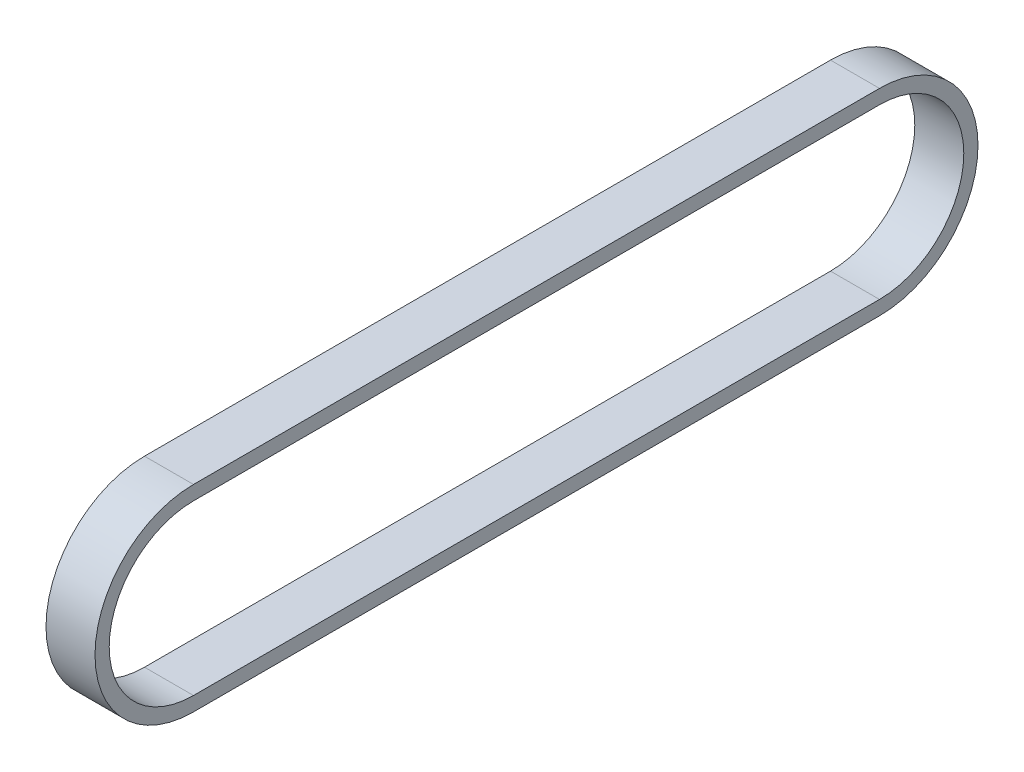
ISO-10303-21;
HEADER;
FILE_DESCRIPTION(('STEP AP214'),'2;1');
FILE_NAME('part.step','',(''),(''),'','','');
FILE_SCHEMA(('AUTOMOTIVE_DESIGN { 1 0 10303 214 1 1 1 1 }'));
ENDSEC;
DATA;
#1=APPLICATION_CONTEXT('core data for automotive mechanical design processes');
#2=APPLICATION_PROTOCOL_DEFINITION('international standard','automotive_design',2000,#1);
#3=PRODUCT_CONTEXT('',#1,'mechanical');
#4=PRODUCT('Part','Part','',(#3));
#5=PRODUCT_RELATED_PRODUCT_CATEGORY('part','',(#4));
#6=PRODUCT_DEFINITION_FORMATION('','',#4);
#7=PRODUCT_DEFINITION_CONTEXT('part definition',#1,'design');
#8=PRODUCT_DEFINITION('design','',#6,#7);
#9=PRODUCT_DEFINITION_SHAPE('','',#8);
#10=(LENGTH_UNIT() NAMED_UNIT(*) SI_UNIT(.MILLI.,.METRE.));
#11=(NAMED_UNIT(*) PLANE_ANGLE_UNIT() SI_UNIT($,.RADIAN.));
#12=(NAMED_UNIT(*) SI_UNIT($,.STERADIAN.) SOLID_ANGLE_UNIT());
#13=UNCERTAINTY_MEASURE_WITH_UNIT(LENGTH_MEASURE(1.E-05),#10,'distance_accuracy_value','');
#14=(GEOMETRIC_REPRESENTATION_CONTEXT(3) GLOBAL_UNCERTAINTY_ASSIGNED_CONTEXT((#13)) GLOBAL_UNIT_ASSIGNED_CONTEXT((#10,
#11,#12)) REPRESENTATION_CONTEXT('',''));
#15=CARTESIAN_POINT('',(0.,0.,0.));
#16=DIRECTION('',(0.,0.,1.));
#17=DIRECTION('',(1.,0.,0.));
#18=AXIS2_PLACEMENT_3D('',#15,#16,#17);
#19=CARTESIAN_POINT('',(12.7,0.,0.));
#20=DIRECTION('',(1.,0.,0.));
#21=DIRECTION('',(0.,0.,-1.));
#22=AXIS2_PLACEMENT_3D('',#19,#20,#21);
#23=PLANE('',#22);
#24=CARTESIAN_POINT('',(12.7,0.,0.));
#25=DIRECTION('',(1.,0.,0.));
#26=DIRECTION('',(0.,0.,-1.));
#27=AXIS2_PLACEMENT_3D('',#24,#25,#26);
#28=CIRCLE('',#27,25.527);
#29=CARTESIAN_POINT('',(12.7,25.527,0.));
#30=VERTEX_POINT('',#29);
#31=CARTESIAN_POINT('',(12.7,-25.527,0.));
#32=VERTEX_POINT('',#31);
#33=EDGE_CURVE('E135',#30,#32,#28,.T.);
#34=ORIENTED_EDGE('',*,*,#33,.T.);
#35=DIRECTION('',(0.,0.,-1.));
#36=VECTOR('',#35,1.);
#37=CARTESIAN_POINT('',(12.7,-25.527,0.));
#38=LINE('',#37,#36);
#39=CARTESIAN_POINT('',(12.7,-25.527,-177.8));
#40=VERTEX_POINT('',#39);
#41=EDGE_CURVE('E138',#32,#40,#38,.T.);
#42=ORIENTED_EDGE('',*,*,#41,.T.);
#43=CARTESIAN_POINT('',(12.7,0.,-177.8));
#44=DIRECTION('',(1.,0.,0.));
#45=DIRECTION('',(0.,0.,-1.));
#46=AXIS2_PLACEMENT_3D('',#43,#44,#45);
#47=CIRCLE('',#46,25.527);
#48=CARTESIAN_POINT('',(12.7,25.527,-177.8));
#49=VERTEX_POINT('',#48);
#50=EDGE_CURVE('E141',#40,#49,#47,.T.);
#51=ORIENTED_EDGE('',*,*,#50,.T.);
#52=DIRECTION('',(0.,0.,1.));
#53=VECTOR('',#52,1.);
#54=CARTESIAN_POINT('',(12.7,25.527,0.));
#55=LINE('',#54,#53);
#56=EDGE_CURVE('E143',#49,#30,#55,.T.);
#57=ORIENTED_EDGE('',*,*,#56,.T.);
#58=EDGE_LOOP('',(#34,#42,#51,#57));
#59=FACE_BOUND('',#58,.T.);
#60=DIRECTION('',(0.,0.,-1.));
#61=VECTOR('',#60,1.);
#62=CARTESIAN_POINT('',(12.7,-21.844,0.));
#63=LINE('',#62,#61);
#64=CARTESIAN_POINT('',(12.7,-21.844,0.));
#65=VERTEX_POINT('',#64);
#66=CARTESIAN_POINT('',(12.7,-21.844,-177.8));
#67=VERTEX_POINT('',#66);
#68=EDGE_CURVE('E107',#65,#67,#63,.T.);
#69=ORIENTED_EDGE('',*,*,#68,.F.);
#70=CARTESIAN_POINT('',(12.7,0.,0.));
#71=DIRECTION('',(1.,0.,0.));
#72=DIRECTION('',(0.,0.,-1.));
#73=AXIS2_PLACEMENT_3D('',#70,#71,#72);
#74=CIRCLE('',#73,21.844);
#75=CARTESIAN_POINT('',(12.7,21.844,0.));
#76=VERTEX_POINT('',#75);
#77=EDGE_CURVE('E99',#76,#65,#74,.T.);
#78=ORIENTED_EDGE('',*,*,#77,.F.);
#79=DIRECTION('',(0.,0.,1.));
#80=VECTOR('',#79,1.);
#81=CARTESIAN_POINT('',(12.7,21.844,0.));
#82=LINE('',#81,#80);
#83=CARTESIAN_POINT('',(12.7,21.844,-177.8));
#84=VERTEX_POINT('',#83);
#85=EDGE_CURVE('E121',#84,#76,#82,.T.);
#86=ORIENTED_EDGE('',*,*,#85,.F.);
#87=CARTESIAN_POINT('',(12.7,0.,-177.8));
#88=DIRECTION('',(1.,0.,0.));
#89=DIRECTION('',(0.,0.,-1.));
#90=AXIS2_PLACEMENT_3D('',#87,#88,#89);
#91=CIRCLE('',#90,21.844);
#92=EDGE_CURVE('E119',#67,#84,#91,.T.);
#93=ORIENTED_EDGE('',*,*,#92,.F.);
#94=EDGE_LOOP('',(#69,#78,#86,#93));
#95=FACE_BOUND('',#94,.T.);
#96=ADVANCED_FACE('F34',(#59,#95),#23,.T.);
#97=CARTESIAN_POINT('',(0.,0.,0.));
#98=DIRECTION('',(1.,0.,0.));
#99=DIRECTION('',(0.,0.,-1.));
#100=AXIS2_PLACEMENT_3D('',#97,#98,#99);
#101=PLANE('',#100);
#102=CARTESIAN_POINT('',(0.,0.,0.));
#103=DIRECTION('',(1.,0.,0.));
#104=DIRECTION('',(0.,0.,-1.));
#105=AXIS2_PLACEMENT_3D('',#102,#103,#104);
#106=CIRCLE('',#105,25.527);
#107=CARTESIAN_POINT('',(0.,25.527,0.));
#108=VERTEX_POINT('',#107);
#109=CARTESIAN_POINT('',(0.,-25.527,0.));
#110=VERTEX_POINT('',#109);
#111=EDGE_CURVE('E115',#108,#110,#106,.T.);
#112=ORIENTED_EDGE('',*,*,#111,.F.);
#113=DIRECTION('',(0.,0.,1.));
#114=VECTOR('',#113,1.);
#115=CARTESIAN_POINT('',(0.,25.527,0.));
#116=LINE('',#115,#114);
#117=CARTESIAN_POINT('',(0.,25.527,-177.8));
#118=VERTEX_POINT('',#117);
#119=EDGE_CURVE('E139',#118,#108,#116,.T.);
#120=ORIENTED_EDGE('',*,*,#119,.F.);
#121=CARTESIAN_POINT('',(0.,0.,-177.8));
#122=DIRECTION('',(1.,0.,0.));
#123=DIRECTION('',(0.,0.,-1.));
#124=AXIS2_PLACEMENT_3D('',#121,#122,#123);
#125=CIRCLE('',#124,25.527);
#126=CARTESIAN_POINT('',(0.,-25.527,-177.8));
#127=VERTEX_POINT('',#126);
#128=EDGE_CURVE('E150',#127,#118,#125,.T.);
#129=ORIENTED_EDGE('',*,*,#128,.F.);
#130=DIRECTION('',(0.,0.,-1.));
#131=VECTOR('',#130,1.);
#132=CARTESIAN_POINT('',(0.,-25.527,0.));
#133=LINE('',#132,#131);
#134=EDGE_CURVE('E148',#110,#127,#133,.T.);
#135=ORIENTED_EDGE('',*,*,#134,.F.);
#136=EDGE_LOOP('',(#112,#120,#129,#135));
#137=FACE_BOUND('',#136,.T.);
#138=CARTESIAN_POINT('',(0.,0.,0.));
#139=DIRECTION('',(1.,0.,0.));
#140=DIRECTION('',(0.,0.,-1.));
#141=AXIS2_PLACEMENT_3D('',#138,#139,#140);
#142=CIRCLE('',#141,21.844);
#143=CARTESIAN_POINT('',(0.,21.844,0.));
#144=VERTEX_POINT('',#143);
#145=CARTESIAN_POINT('',(0.,-21.844,0.));
#146=VERTEX_POINT('',#145);
#147=EDGE_CURVE('E57',#144,#146,#142,.T.);
#148=ORIENTED_EDGE('',*,*,#147,.T.);
#149=DIRECTION('',(0.,0.,-1.));
#150=VECTOR('',#149,1.);
#151=CARTESIAN_POINT('',(0.,-21.844,0.));
#152=LINE('',#151,#150);
#153=CARTESIAN_POINT('',(0.,-21.844,-177.8));
#154=VERTEX_POINT('',#153);
#155=EDGE_CURVE('E114',#146,#154,#152,.T.);
#156=ORIENTED_EDGE('',*,*,#155,.T.);
#157=CARTESIAN_POINT('',(0.,0.,-177.8));
#158=DIRECTION('',(1.,0.,0.));
#159=DIRECTION('',(0.,0.,-1.));
#160=AXIS2_PLACEMENT_3D('',#157,#158,#159);
#161=CIRCLE('',#160,21.844);
#162=CARTESIAN_POINT('',(0.,21.844,-177.8));
#163=VERTEX_POINT('',#162);
#164=EDGE_CURVE('E127',#154,#163,#161,.T.);
#165=ORIENTED_EDGE('',*,*,#164,.T.);
#166=DIRECTION('',(0.,0.,1.));
#167=VECTOR('',#166,1.);
#168=CARTESIAN_POINT('',(0.,21.844,0.));
#169=LINE('',#168,#167);
#170=EDGE_CURVE('E108',#163,#144,#169,.T.);
#171=ORIENTED_EDGE('',*,*,#170,.T.);
#172=EDGE_LOOP('',(#148,#156,#165,#171));
#173=FACE_BOUND('',#172,.T.);
#174=ADVANCED_FACE('F168',(#137,#173),#101,.F.);
#175=CARTESIAN_POINT('',(12.7,0.,0.));
#176=DIRECTION('',(-1.,0.,0.));
#177=DIRECTION('',(0.,0.,1.));
#178=AXIS2_PLACEMENT_3D('',#175,#176,#177);
#179=CYLINDRICAL_SURFACE('',#178,25.527);
#180=ORIENTED_EDGE('',*,*,#111,.T.);
#181=DIRECTION('',(-1.,0.,0.));
#182=VECTOR('',#181,1.);
#183=CARTESIAN_POINT('',(12.7,-25.527,0.));
#184=LINE('',#183,#182);
#185=EDGE_CURVE('E11',#32,#110,#184,.T.);
#186=ORIENTED_EDGE('',*,*,#185,.F.);
#187=ORIENTED_EDGE('',*,*,#33,.F.);
#188=DIRECTION('',(-1.,0.,0.));
#189=VECTOR('',#188,1.);
#190=CARTESIAN_POINT('',(12.7,25.527,0.));
#191=LINE('',#190,#189);
#192=EDGE_CURVE('E145',#30,#108,#191,.T.);
#193=ORIENTED_EDGE('',*,*,#192,.T.);
#194=EDGE_LOOP('',(#180,#186,#187,#193));
#195=FACE_BOUND('',#194,.T.);
#196=ADVANCED_FACE('F36',(#195),#179,.T.);
#197=CARTESIAN_POINT('',(12.7,-25.527,0.));
#198=DIRECTION('',(0.,1.,0.));
#199=DIRECTION('',(0.,0.,1.));
#200=AXIS2_PLACEMENT_3D('',#197,#198,#199);
#201=PLANE('',#200);
#202=ORIENTED_EDGE('',*,*,#134,.T.);
#203=DIRECTION('',(-1.,0.,0.));
#204=VECTOR('',#203,1.);
#205=CARTESIAN_POINT('',(12.7,-25.527,-177.8));
#206=LINE('',#205,#204);
#207=EDGE_CURVE('E42',#40,#127,#206,.T.);
#208=ORIENTED_EDGE('',*,*,#207,.F.);
#209=ORIENTED_EDGE('',*,*,#41,.F.);
#210=ORIENTED_EDGE('',*,*,#185,.T.);
#211=EDGE_LOOP('',(#202,#208,#209,#210));
#212=FACE_BOUND('',#211,.T.);
#213=ADVANCED_FACE('F178',(#212),#201,.F.);
#214=CARTESIAN_POINT('',(12.7,0.,-177.8));
#215=DIRECTION('',(-1.,0.,0.));
#216=DIRECTION('',(0.,0.,1.));
#217=AXIS2_PLACEMENT_3D('',#214,#215,#216);
#218=CYLINDRICAL_SURFACE('',#217,25.527);
#219=ORIENTED_EDGE('',*,*,#128,.T.);
#220=DIRECTION('',(-1.,0.,0.));
#221=VECTOR('',#220,1.);
#222=CARTESIAN_POINT('',(12.7,25.527,-177.8));
#223=LINE('',#222,#221);
#224=EDGE_CURVE('E155',#49,#118,#223,.T.);
#225=ORIENTED_EDGE('',*,*,#224,.F.);
#226=ORIENTED_EDGE('',*,*,#50,.F.);
#227=ORIENTED_EDGE('',*,*,#207,.T.);
#228=EDGE_LOOP('',(#219,#225,#226,#227));
#229=FACE_BOUND('',#228,.T.);
#230=ADVANCED_FACE('F162',(#229),#218,.T.);
#231=CARTESIAN_POINT('',(12.7,25.527,0.));
#232=DIRECTION('',(0.,-1.,0.));
#233=DIRECTION('',(0.,0.,-1.));
#234=AXIS2_PLACEMENT_3D('',#231,#232,#233);
#235=PLANE('',#234);
#236=ORIENTED_EDGE('',*,*,#119,.T.);
#237=ORIENTED_EDGE('',*,*,#192,.F.);
#238=ORIENTED_EDGE('',*,*,#56,.F.);
#239=ORIENTED_EDGE('',*,*,#224,.T.);
#240=EDGE_LOOP('',(#236,#237,#238,#239));
#241=FACE_BOUND('',#240,.T.);
#242=ADVANCED_FACE('F172',(#241),#235,.F.);
#243=CARTESIAN_POINT('',(12.7,0.,0.));
#244=DIRECTION('',(-1.,0.,0.));
#245=DIRECTION('',(0.,0.,1.));
#246=AXIS2_PLACEMENT_3D('',#243,#244,#245);
#247=CYLINDRICAL_SURFACE('',#246,21.844);
#248=ORIENTED_EDGE('',*,*,#147,.F.);
#249=DIRECTION('',(-1.,0.,0.));
#250=VECTOR('',#249,1.);
#251=CARTESIAN_POINT('',(12.7,21.844,0.));
#252=LINE('',#251,#250);
#253=EDGE_CURVE('E103',#76,#144,#252,.T.);
#254=ORIENTED_EDGE('',*,*,#253,.F.);
#255=ORIENTED_EDGE('',*,*,#77,.T.);
#256=DIRECTION('',(-1.,0.,0.));
#257=VECTOR('',#256,1.);
#258=CARTESIAN_POINT('',(12.7,-21.844,0.));
#259=LINE('',#258,#257);
#260=EDGE_CURVE('E102',#65,#146,#259,.T.);
#261=ORIENTED_EDGE('',*,*,#260,.T.);
#262=EDGE_LOOP('',(#248,#254,#255,#261));
#263=FACE_BOUND('',#262,.T.);
#264=ADVANCED_FACE('F101',(#263),#247,.F.);
#265=CARTESIAN_POINT('',(12.7,-21.844,0.));
#266=DIRECTION('',(0.,1.,0.));
#267=DIRECTION('',(0.,0.,1.));
#268=AXIS2_PLACEMENT_3D('',#265,#266,#267);
#269=PLANE('',#268);
#270=ORIENTED_EDGE('',*,*,#155,.F.);
#271=ORIENTED_EDGE('',*,*,#260,.F.);
#272=ORIENTED_EDGE('',*,*,#68,.T.);
#273=DIRECTION('',(-1.,0.,0.));
#274=VECTOR('',#273,1.);
#275=CARTESIAN_POINT('',(12.7,-21.844,-177.8));
#276=LINE('',#275,#274);
#277=EDGE_CURVE('E116',#67,#154,#276,.T.);
#278=ORIENTED_EDGE('',*,*,#277,.T.);
#279=EDGE_LOOP('',(#270,#271,#272,#278));
#280=FACE_BOUND('',#279,.T.);
#281=ADVANCED_FACE('F111',(#280),#269,.T.);
#282=CARTESIAN_POINT('',(12.7,0.,-177.8));
#283=DIRECTION('',(-1.,0.,0.));
#284=DIRECTION('',(0.,0.,1.));
#285=AXIS2_PLACEMENT_3D('',#282,#283,#284);
#286=CYLINDRICAL_SURFACE('',#285,21.844);
#287=ORIENTED_EDGE('',*,*,#164,.F.);
#288=ORIENTED_EDGE('',*,*,#277,.F.);
#289=ORIENTED_EDGE('',*,*,#92,.T.);
#290=DIRECTION('',(-1.,0.,0.));
#291=VECTOR('',#290,1.);
#292=CARTESIAN_POINT('',(12.7,21.844,-177.8));
#293=LINE('',#292,#291);
#294=EDGE_CURVE('E49',#84,#163,#293,.T.);
#295=ORIENTED_EDGE('',*,*,#294,.T.);
#296=EDGE_LOOP('',(#287,#288,#289,#295));
#297=FACE_BOUND('',#296,.T.);
#298=ADVANCED_FACE('F201',(#297),#286,.F.);
#299=CARTESIAN_POINT('',(12.7,21.844,0.));
#300=DIRECTION('',(0.,-1.,0.));
#301=DIRECTION('',(0.,0.,-1.));
#302=AXIS2_PLACEMENT_3D('',#299,#300,#301);
#303=PLANE('',#302);
#304=ORIENTED_EDGE('',*,*,#170,.F.);
#305=ORIENTED_EDGE('',*,*,#294,.F.);
#306=ORIENTED_EDGE('',*,*,#85,.T.);
#307=ORIENTED_EDGE('',*,*,#253,.T.);
#308=EDGE_LOOP('',(#304,#305,#306,#307));
#309=FACE_BOUND('',#308,.T.);
#310=ADVANCED_FACE('F205',(#309),#303,.T.);
#311=CLOSED_SHELL('',(#96,#174,#196,#213,#230,#242,#264,#281,#298,#310));
#312=MANIFOLD_SOLID_BREP('B2',#311);
#313=ADVANCED_BREP_SHAPE_REPRESENTATION('',(#18,#312),#14);
#314=SHAPE_DEFINITION_REPRESENTATION(#9,#313);
ENDSEC;
END-ISO-10303-21;
